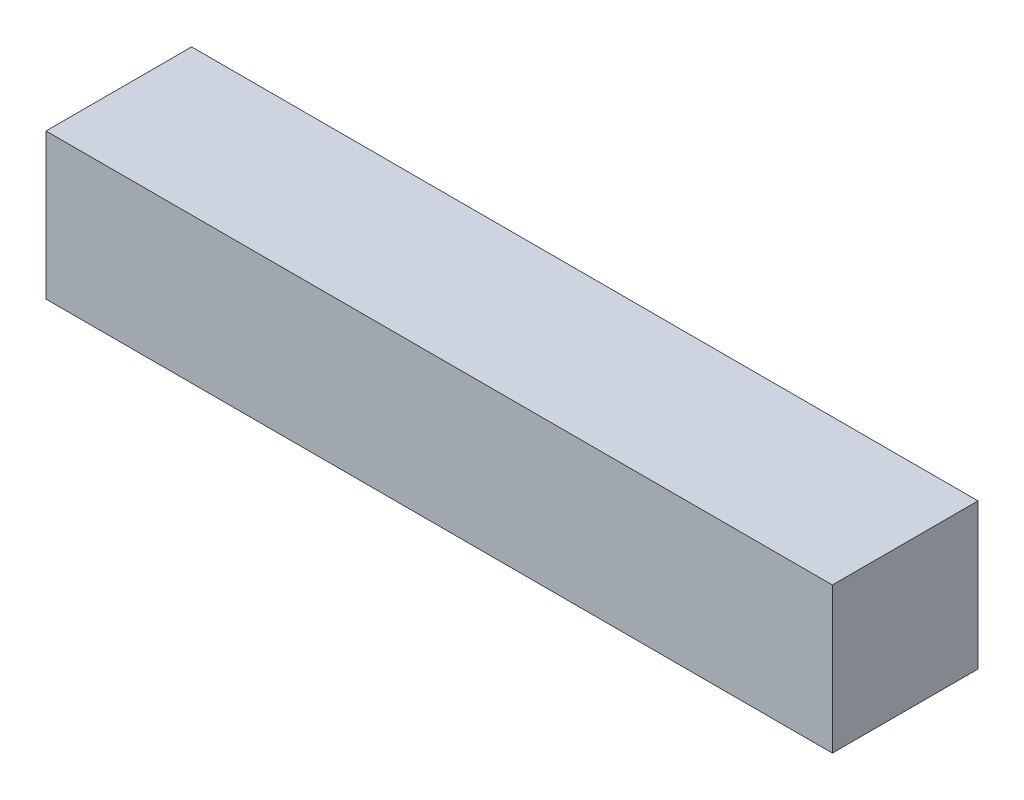
ISO-10303-21;
HEADER;
FILE_DESCRIPTION(('STEP AP214'),'2;1');
FILE_NAME('part.step','',(''),(''),'','','');
FILE_SCHEMA(('AUTOMOTIVE_DESIGN { 1 0 10303 214 1 1 1 1 }'));
ENDSEC;
DATA;
#1=APPLICATION_CONTEXT('core data for automotive mechanical design processes');
#2=APPLICATION_PROTOCOL_DEFINITION('international standard','automotive_design',2000,#1);
#3=PRODUCT_CONTEXT('',#1,'mechanical');
#4=PRODUCT('Part','Part','',(#3));
#5=PRODUCT_RELATED_PRODUCT_CATEGORY('part','',(#4));
#6=PRODUCT_DEFINITION_FORMATION('','',#4);
#7=PRODUCT_DEFINITION_CONTEXT('part definition',#1,'design');
#8=PRODUCT_DEFINITION('design','',#6,#7);
#9=PRODUCT_DEFINITION_SHAPE('','',#8);
#10=(LENGTH_UNIT() NAMED_UNIT(*) SI_UNIT(.MILLI.,.METRE.));
#11=(NAMED_UNIT(*) PLANE_ANGLE_UNIT() SI_UNIT($,.RADIAN.));
#12=(NAMED_UNIT(*) SI_UNIT($,.STERADIAN.) SOLID_ANGLE_UNIT());
#13=UNCERTAINTY_MEASURE_WITH_UNIT(LENGTH_MEASURE(1.E-05),#10,'distance_accuracy_value','');
#14=(GEOMETRIC_REPRESENTATION_CONTEXT(3) GLOBAL_UNCERTAINTY_ASSIGNED_CONTEXT((#13)) GLOBAL_UNIT_ASSIGNED_CONTEXT((#10,
#11,#12)) REPRESENTATION_CONTEXT('',''));
#15=CARTESIAN_POINT('',(0.,0.,0.));
#16=DIRECTION('',(0.,0.,1.));
#17=DIRECTION('',(1.,0.,0.));
#18=AXIS2_PLACEMENT_3D('',#15,#16,#17);
#19=CARTESIAN_POINT('',(27.,-5.,5.));
#20=DIRECTION('',(-1.,0.,0.));
#21=DIRECTION('',(0.,0.,1.));
#22=AXIS2_PLACEMENT_3D('',#19,#20,#21);
#23=PLANE('',#22);
#24=DIRECTION('',(0.,1.,0.));
#25=VECTOR('',#24,1.);
#26=CARTESIAN_POINT('',(27.,-5.,-5.));
#27=LINE('',#26,#25);
#28=CARTESIAN_POINT('',(27.,-5.,-5.));
#29=VERTEX_POINT('',#28);
#30=CARTESIAN_POINT('',(27.,5.,-5.));
#31=VERTEX_POINT('',#30);
#32=EDGE_CURVE('E96',#29,#31,#27,.T.);
#33=ORIENTED_EDGE('',*,*,#32,.T.);
#34=DIRECTION('',(0.,0.,-1.));
#35=VECTOR('',#34,1.);
#36=CARTESIAN_POINT('',(27.,5.,5.));
#37=LINE('',#36,#35);
#38=CARTESIAN_POINT('',(27.,5.,5.));
#39=VERTEX_POINT('',#38);
#40=EDGE_CURVE('E11',#39,#31,#37,.T.);
#41=ORIENTED_EDGE('',*,*,#40,.F.);
#42=DIRECTION('',(0.,1.,0.));
#43=VECTOR('',#42,1.);
#44=CARTESIAN_POINT('',(27.,-5.,5.));
#45=LINE('',#44,#43);
#46=CARTESIAN_POINT('',(27.,-5.,5.));
#47=VERTEX_POINT('',#46);
#48=EDGE_CURVE('E84',#47,#39,#45,.T.);
#49=ORIENTED_EDGE('',*,*,#48,.F.);
#50=DIRECTION('',(0.,0.,-1.));
#51=VECTOR('',#50,1.);
#52=CARTESIAN_POINT('',(27.,-5.,5.));
#53=LINE('',#52,#51);
#54=EDGE_CURVE('E92',#47,#29,#53,.T.);
#55=ORIENTED_EDGE('',*,*,#54,.T.);
#56=EDGE_LOOP('',(#33,#41,#49,#55));
#57=FACE_BOUND('',#56,.T.);
#58=ADVANCED_FACE('F33',(#57),#23,.F.);
#59=CARTESIAN_POINT('',(-27.,5.,5.));
#60=DIRECTION('',(0.,-1.,0.));
#61=DIRECTION('',(0.,0.,-1.));
#62=AXIS2_PLACEMENT_3D('',#59,#60,#61);
#63=PLANE('',#62);
#64=DIRECTION('',(-1.,0.,0.));
#65=VECTOR('',#64,1.);
#66=CARTESIAN_POINT('',(-27.,5.,-5.));
#67=LINE('',#66,#65);
#68=CARTESIAN_POINT('',(-27.,5.,-5.));
#69=VERTEX_POINT('',#68);
#70=EDGE_CURVE('E88',#31,#69,#67,.T.);
#71=ORIENTED_EDGE('',*,*,#70,.T.);
#72=DIRECTION('',(0.,0.,-1.));
#73=VECTOR('',#72,1.);
#74=CARTESIAN_POINT('',(-27.,5.,5.));
#75=LINE('',#74,#73);
#76=CARTESIAN_POINT('',(-27.,5.,5.));
#77=VERTEX_POINT('',#76);
#78=EDGE_CURVE('E41',#77,#69,#75,.T.);
#79=ORIENTED_EDGE('',*,*,#78,.F.);
#80=DIRECTION('',(-1.,0.,0.));
#81=VECTOR('',#80,1.);
#82=CARTESIAN_POINT('',(-27.,5.,5.));
#83=LINE('',#82,#81);
#84=EDGE_CURVE('E79',#39,#77,#83,.T.);
#85=ORIENTED_EDGE('',*,*,#84,.F.);
#86=ORIENTED_EDGE('',*,*,#40,.T.);
#87=EDGE_LOOP('',(#71,#79,#85,#86));
#88=FACE_BOUND('',#87,.T.);
#89=ADVANCED_FACE('F87',(#88),#63,.F.);
#90=CARTESIAN_POINT('',(-27.,-5.,5.));
#91=DIRECTION('',(1.,0.,0.));
#92=DIRECTION('',(0.,0.,-1.));
#93=AXIS2_PLACEMENT_3D('',#90,#91,#92);
#94=PLANE('',#93);
#95=DIRECTION('',(0.,-1.,0.));
#96=VECTOR('',#95,1.);
#97=CARTESIAN_POINT('',(-27.,-5.,-5.));
#98=LINE('',#97,#96);
#99=CARTESIAN_POINT('',(-27.,-5.,-5.));
#100=VERTEX_POINT('',#99);
#101=EDGE_CURVE('E66',#69,#100,#98,.T.);
#102=ORIENTED_EDGE('',*,*,#101,.T.);
#103=DIRECTION('',(0.,0.,-1.));
#104=VECTOR('',#103,1.);
#105=CARTESIAN_POINT('',(-27.,-5.,5.));
#106=LINE('',#105,#104);
#107=CARTESIAN_POINT('',(-27.,-5.,5.));
#108=VERTEX_POINT('',#107);
#109=EDGE_CURVE('E89',#108,#100,#106,.T.);
#110=ORIENTED_EDGE('',*,*,#109,.F.);
#111=DIRECTION('',(0.,-1.,0.));
#112=VECTOR('',#111,1.);
#113=CARTESIAN_POINT('',(-27.,-5.,5.));
#114=LINE('',#113,#112);
#115=EDGE_CURVE('E82',#77,#108,#114,.T.);
#116=ORIENTED_EDGE('',*,*,#115,.F.);
#117=ORIENTED_EDGE('',*,*,#78,.T.);
#118=EDGE_LOOP('',(#102,#110,#116,#117));
#119=FACE_BOUND('',#118,.T.);
#120=ADVANCED_FACE('F90',(#119),#94,.F.);
#121=CARTESIAN_POINT('',(-27.,-5.,5.));
#122=DIRECTION('',(0.,1.,0.));
#123=DIRECTION('',(0.,0.,1.));
#124=AXIS2_PLACEMENT_3D('',#121,#122,#123);
#125=PLANE('',#124);
#126=DIRECTION('',(1.,0.,0.));
#127=VECTOR('',#126,1.);
#128=CARTESIAN_POINT('',(-27.,-5.,-5.));
#129=LINE('',#128,#127);
#130=EDGE_CURVE('E72',#100,#29,#129,.T.);
#131=ORIENTED_EDGE('',*,*,#130,.T.);
#132=ORIENTED_EDGE('',*,*,#54,.F.);
#133=DIRECTION('',(1.,0.,0.));
#134=VECTOR('',#133,1.);
#135=CARTESIAN_POINT('',(-27.,-5.,5.));
#136=LINE('',#135,#134);
#137=EDGE_CURVE('E49',#108,#47,#136,.T.);
#138=ORIENTED_EDGE('',*,*,#137,.F.);
#139=ORIENTED_EDGE('',*,*,#109,.T.);
#140=EDGE_LOOP('',(#131,#132,#138,#139));
#141=FACE_BOUND('',#140,.T.);
#142=ADVANCED_FACE('F103',(#141),#125,.F.);
#143=CARTESIAN_POINT('',(0.,0.,5.));
#144=DIRECTION('',(0.,0.,-1.));
#145=DIRECTION('',(-1.,0.,0.));
#146=AXIS2_PLACEMENT_3D('',#143,#144,#145);
#147=PLANE('',#146);
#148=ORIENTED_EDGE('',*,*,#48,.T.);
#149=ORIENTED_EDGE('',*,*,#84,.T.);
#150=ORIENTED_EDGE('',*,*,#115,.T.);
#151=ORIENTED_EDGE('',*,*,#137,.T.);
#152=EDGE_LOOP('',(#148,#149,#150,#151));
#153=FACE_BOUND('',#152,.T.);
#154=ADVANCED_FACE('F80',(#153),#147,.F.);
#155=CARTESIAN_POINT('',(0.,0.,-5.));
#156=DIRECTION('',(0.,0.,-1.));
#157=DIRECTION('',(-1.,0.,0.));
#158=AXIS2_PLACEMENT_3D('',#155,#156,#157);
#159=PLANE('',#158);
#160=ORIENTED_EDGE('',*,*,#32,.F.);
#161=ORIENTED_EDGE('',*,*,#130,.F.);
#162=ORIENTED_EDGE('',*,*,#101,.F.);
#163=ORIENTED_EDGE('',*,*,#70,.F.);
#164=EDGE_LOOP('',(#160,#161,#162,#163));
#165=FACE_BOUND('',#164,.T.);
#166=ADVANCED_FACE('F106',(#165),#159,.T.);
#167=CLOSED_SHELL('',(#58,#89,#120,#142,#154,#166));
#168=MANIFOLD_SOLID_BREP('B2',#167);
#169=ADVANCED_BREP_SHAPE_REPRESENTATION('',(#18,#168),#14);
#170=SHAPE_DEFINITION_REPRESENTATION(#9,#169);
ENDSEC;
END-ISO-10303-21;
